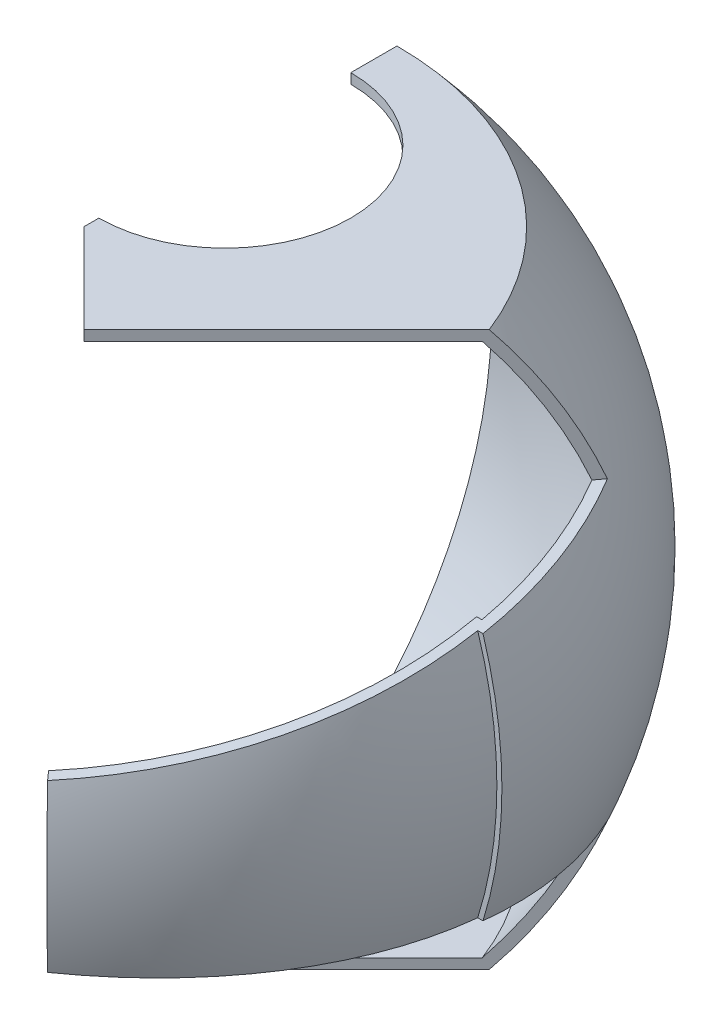
ISO-10303-21;
HEADER;
FILE_DESCRIPTION(('STEP AP214'),'2;1');
FILE_NAME('part.step','',(''),(''),'','','');
FILE_SCHEMA(('AUTOMOTIVE_DESIGN { 1 0 10303 214 1 1 1 1 }'));
ENDSEC;
DATA;
#1=APPLICATION_CONTEXT('core data for automotive mechanical design processes');
#2=APPLICATION_PROTOCOL_DEFINITION('international standard','automotive_design',2000,#1);
#3=PRODUCT_CONTEXT('',#1,'mechanical');
#4=PRODUCT('Part','Part','',(#3));
#5=PRODUCT_RELATED_PRODUCT_CATEGORY('part','',(#4));
#6=PRODUCT_DEFINITION_FORMATION('','',#4);
#7=PRODUCT_DEFINITION_CONTEXT('part definition',#1,'design');
#8=PRODUCT_DEFINITION('design','',#6,#7);
#9=PRODUCT_DEFINITION_SHAPE('','',#8);
#10=(LENGTH_UNIT() NAMED_UNIT(*) SI_UNIT(.MILLI.,.METRE.));
#11=(NAMED_UNIT(*) PLANE_ANGLE_UNIT() SI_UNIT($,.RADIAN.));
#12=(NAMED_UNIT(*) SI_UNIT($,.STERADIAN.) SOLID_ANGLE_UNIT());
#13=UNCERTAINTY_MEASURE_WITH_UNIT(LENGTH_MEASURE(1.E-05),#10,'distance_accuracy_value','');
#14=(GEOMETRIC_REPRESENTATION_CONTEXT(3) GLOBAL_UNCERTAINTY_ASSIGNED_CONTEXT((#13)) GLOBAL_UNIT_ASSIGNED_CONTEXT((#10,
#11,#12)) REPRESENTATION_CONTEXT('',''));
#15=CARTESIAN_POINT('',(0.,0.,0.));
#16=DIRECTION('',(0.,0.,1.));
#17=DIRECTION('',(1.,0.,0.));
#18=AXIS2_PLACEMENT_3D('',#15,#16,#17);
#19=CARTESIAN_POINT('',(0.,55.,0.));
#20=DIRECTION('',(0.750387128659196,0.,-0.660998606006554));
#21=DIRECTION('',(-0.660998606006554,0.,-0.750387128659196));
#22=AXIS2_PLACEMENT_3D('',#19,#20,#21);
#23=PLANE('',#22);
#24=CARTESIAN_POINT('',(0.,0.,0.));
#25=DIRECTION('',(0.750387128659196,0.,-0.660998606006554));
#26=DIRECTION('',(-0.660998606006554,0.,-0.750387128659196));
#27=AXIS2_PLACEMENT_3D('',#24,#25,#26);
#28=CIRCLE('',#27,80.);
#29=CARTESIAN_POINT('',(51.7144227177922,-16.7033371988998,58.7078956307016));
#30=VERTEX_POINT('',#29);
#31=CARTESIAN_POINT('',(51.7144227177921,16.7033371989004,58.7078956307015));
#32=VERTEX_POINT('',#31);
#33=EDGE_CURVE('E311',#30,#32,#28,.F.);
#34=ORIENTED_EDGE('',*,*,#33,.F.);
#35=DIRECTION('',(0.657579727016787,0.101576744243743,0.746505905968177));
#36=VECTOR('',#35,1.);
#37=CARTESIAN_POINT('',(-18.6599209054811,-27.5741052743883,-21.1833494685659));
#38=LINE('',#37,#36);
#39=CARTESIAN_POINT('',(53.0945878796753,-16.4901422388016,60.2747040376933));
#40=VERTEX_POINT('',#39);
#41=EDGE_CURVE('E284',#30,#40,#38,.T.);
#42=ORIENTED_EDGE('',*,*,#41,.T.);
#43=CARTESIAN_POINT('',(0.,0.,0.));
#44=DIRECTION('',(0.750387128659196,0.,-0.660998606006554));
#45=DIRECTION('',(-0.660998606006554,0.,-0.750387128659196));
#46=AXIS2_PLACEMENT_3D('',#43,#44,#45);
#47=CIRCLE('',#46,82.);
#48=CARTESIAN_POINT('',(53.0945878796752,16.4901422388022,60.2747040376933));
#49=VERTEX_POINT('',#48);
#50=EDGE_CURVE('E216',#40,#49,#47,.F.);
#51=ORIENTED_EDGE('',*,*,#50,.T.);
#52=DIRECTION('',(-0.657579727016787,0.101576744243744,-0.746505905968177));
#53=VECTOR('',#52,1.);
#54=CARTESIAN_POINT('',(-18.6599209054811,27.5741052743889,-21.1833494685658));
#55=LINE('',#54,#53);
#56=EDGE_CURVE('E286',#49,#32,#55,.T.);
#57=ORIENTED_EDGE('',*,*,#56,.T.);
#58=EDGE_LOOP('',(#34,#42,#51,#57));
#59=FACE_BOUND('',#58,.T.);
#60=ADVANCED_FACE('F34',(#59),#23,.F.);
#61=CARTESIAN_POINT('',(0.,0.,0.));
#62=DIRECTION('',(-1.,0.,0.));
#63=DIRECTION('',(0.,0.,1.));
#64=AXIS2_PLACEMENT_3D('',#61,#62,#63);
#65=PLANE('',#64);
#66=DIRECTION('',(0.,0.,1.));
#67=VECTOR('',#66,1.);
#68=CARTESIAN_POINT('',(0.,-53.,0.));
#69=LINE('',#68,#67);
#70=CARTESIAN_POINT('',(0.,-53.,-3.));
#71=VERTEX_POINT('',#70);
#72=CARTESIAN_POINT('',(0.,-53.,0.));
#73=VERTEX_POINT('',#72);
#74=EDGE_CURVE('E171',#71,#73,#69,.T.);
#75=ORIENTED_EDGE('',*,*,#74,.F.);
#76=DIRECTION('',(0.,-1.,0.));
#77=VECTOR('',#76,1.);
#78=CARTESIAN_POINT('',(0.,55.,-3.));
#79=LINE('',#78,#77);
#80=CARTESIAN_POINT('',(0.,-55.,-3.));
#81=VERTEX_POINT('',#80);
#82=EDGE_CURVE('E222',#81,#71,#79,.F.);
#83=ORIENTED_EDGE('',*,*,#82,.F.);
#84=DIRECTION('',(0.,0.,1.));
#85=VECTOR('',#84,1.);
#86=CARTESIAN_POINT('',(0.,-55.,0.));
#87=LINE('',#86,#85);
#88=CARTESIAN_POINT('',(0.,-55.,0.));
#89=VERTEX_POINT('',#88);
#90=EDGE_CURVE('E196',#81,#89,#87,.T.);
#91=ORIENTED_EDGE('',*,*,#90,.T.);
#92=DIRECTION('',(0.,-1.,0.));
#93=VECTOR('',#92,1.);
#94=CARTESIAN_POINT('',(0.,55.,0.));
#95=LINE('',#94,#93);
#96=EDGE_CURVE('E188',#73,#89,#95,.T.);
#97=ORIENTED_EDGE('',*,*,#96,.F.);
#98=EDGE_LOOP('',(#75,#83,#91,#97));
#99=FACE_BOUND('',#98,.T.);
#100=ADVANCED_FACE('F194',(#99),#65,.T.);
#101=CARTESIAN_POINT('',(17.6776695296637,55.,17.6776695296637));
#102=DIRECTION('',(-0.707106781186548,0.,-0.707106781186548));
#103=DIRECTION('',(-0.707106781186548,0.,0.707106781186548));
#104=AXIS2_PLACEMENT_3D('',#101,#102,#103);
#105=PLANE('',#104);
#106=DIRECTION('',(0.707106781186548,0.,-0.707106781186548));
#107=VECTOR('',#106,1.);
#108=CARTESIAN_POINT('',(17.6776695296637,-53.,17.6776695296637));
#109=LINE('',#108,#107);
#110=CARTESIAN_POINT('',(17.6776695296637,-53.,17.6776695296637));
#111=VERTEX_POINT('',#110);
#112=CARTESIAN_POINT('',(57.2187873691988,-53.,-21.8634483098714));
#113=VERTEX_POINT('',#112);
#114=EDGE_CURVE('E191',#111,#113,#109,.T.);
#115=ORIENTED_EDGE('',*,*,#114,.F.);
#116=DIRECTION('',(0.,-1.,0.));
#117=VECTOR('',#116,1.);
#118=CARTESIAN_POINT('',(17.6776695296637,55.,17.6776695296637));
#119=LINE('',#118,#117);
#120=CARTESIAN_POINT('',(17.6776695296637,-55.,17.6776695296637));
#121=VERTEX_POINT('',#120);
#122=EDGE_CURVE('E190',#111,#121,#119,.T.);
#123=ORIENTED_EDGE('',*,*,#122,.T.);
#124=DIRECTION('',(0.707106781186547,0.,-0.707106781186547));
#125=VECTOR('',#124,1.);
#126=CARTESIAN_POINT('',(17.6776695296637,-55.,17.6776695296637));
#127=LINE('',#126,#125);
#128=CARTESIAN_POINT('',(57.9206813453815,-55.,-22.5653422860541));
#129=VERTEX_POINT('',#128);
#130=EDGE_CURVE('E247',#121,#129,#127,.T.);
#131=ORIENTED_EDGE('',*,*,#130,.T.);
#132=CARTESIAN_POINT('',(17.6776695296637,0.,17.6776695296637));
#133=DIRECTION('',(-0.707106781186548,0.,-0.707106781186548));
#134=DIRECTION('',(-0.707106781186548,0.,0.707106781186548));
#135=AXIS2_PLACEMENT_3D('',#132,#133,#134);
#136=CIRCLE('',#135,79.1454357496375);
#137=CARTESIAN_POINT('',(69.6493163382024,-29.3580628791651,-34.2939772788751));
#138=VERTEX_POINT('',#137);
#139=EDGE_CURVE('E276',#129,#138,#136,.F.);
#140=ORIENTED_EDGE('',*,*,#139,.T.);
#141=DIRECTION('',(-0.70385632391182,0.0957734335746568,0.70385632391182));
#142=VECTOR('',#141,1.);
#143=CARTESIAN_POINT('',(12.4677429078581,-21.5773902637812,22.8875961514693));
#144=LINE('',#143,#142);
#145=CARTESIAN_POINT('',(68.1077043208193,-29.1482963811898,-32.7523652614919));
#146=VERTEX_POINT('',#145);
#147=EDGE_CURVE('E252',#138,#146,#144,.T.);
#148=ORIENTED_EDGE('',*,*,#147,.T.);
#149=CARTESIAN_POINT('',(17.6776695296637,0.,17.6776695296637));
#150=DIRECTION('',(-0.707106781186548,0.,-0.707106781186548));
#151=DIRECTION('',(-0.707106781186548,0.,0.707106781186548));
#152=AXIS2_PLACEMENT_3D('',#149,#150,#151);
#153=CIRCLE('',#152,77.0454411370329);
#154=EDGE_CURVE('E318',#113,#146,#153,.F.);
#155=ORIENTED_EDGE('',*,*,#154,.F.);
#156=EDGE_LOOP('',(#115,#123,#131,#140,#148,#155));
#157=FACE_BOUND('',#156,.T.);
#158=ADVANCED_FACE('F350',(#157),#105,.F.);
#159=CARTESIAN_POINT('',(17.6776695296637,0.,17.6776695296637));
#160=DIRECTION('',(-0.707106781186548,0.,-0.707106781186548));
#161=DIRECTION('',(-0.707106781186548,0.,0.707106781186548));
#162=AXIS2_PLACEMENT_3D('',#159,#160,#161);
#163=CIRCLE('',#162,77.0454411370329);
#164=CARTESIAN_POINT('',(68.1077043208191,29.1482963811903,-32.7523652614917));
#165=VERTEX_POINT('',#164);
#166=CARTESIAN_POINT('',(57.2187873691988,53.,-21.8634483098714));
#167=VERTEX_POINT('',#166);
#168=EDGE_CURVE('E315',#165,#167,#163,.F.);
#169=ORIENTED_EDGE('',*,*,#168,.F.);
#170=DIRECTION('',(0.70385632391182,0.095773433574657,-0.70385632391182));
#171=VECTOR('',#170,1.);
#172=CARTESIAN_POINT('',(19.8829239651279,22.5863708274365,15.4724150941995));
#173=LINE('',#172,#171);
#174=CARTESIAN_POINT('',(69.6493163382023,29.3580628791656,-34.2939772788749));
#175=VERTEX_POINT('',#174);
#176=EDGE_CURVE('E257',#165,#175,#173,.T.);
#177=ORIENTED_EDGE('',*,*,#176,.T.);
#178=CARTESIAN_POINT('',(57.9206813453815,55.,-22.5653422860541));
#179=VERTEX_POINT('',#178);
#180=EDGE_CURVE('E277',#175,#179,#136,.F.);
#181=ORIENTED_EDGE('',*,*,#180,.T.);
#182=DIRECTION('',(0.707106781186547,0.,-0.707106781186547));
#183=VECTOR('',#182,1.);
#184=CARTESIAN_POINT('',(17.6776695296637,55.,17.6776695296637));
#185=LINE('',#184,#183);
#186=CARTESIAN_POINT('',(17.6776695296637,55.,17.6776695296637));
#187=VERTEX_POINT('',#186);
#188=EDGE_CURVE('E199',#187,#179,#185,.T.);
#189=ORIENTED_EDGE('',*,*,#188,.F.);
#190=CARTESIAN_POINT('',(17.6776695296637,53.,17.6776695296637));
#191=VERTEX_POINT('',#190);
#192=EDGE_CURVE('E207',#187,#191,#119,.T.);
#193=ORIENTED_EDGE('',*,*,#192,.T.);
#194=DIRECTION('',(0.707106781186548,0.,-0.707106781186548));
#195=VECTOR('',#194,1.);
#196=CARTESIAN_POINT('',(17.6776695296637,53.,17.6776695296637));
#197=LINE('',#196,#195);
#198=EDGE_CURVE('E182',#191,#167,#197,.T.);
#199=ORIENTED_EDGE('',*,*,#198,.T.);
#200=EDGE_LOOP('',(#169,#177,#181,#189,#193,#199));
#201=FACE_BOUND('',#200,.T.);
#202=ADVANCED_FACE('F352',(#201),#105,.F.);
#203=CARTESIAN_POINT('',(-125.508384945895,-14.9999999999997,71.2260294643967));
#204=DIRECTION('',(0.,-0.990869134024361,0.134827145774922));
#205=DIRECTION('',(0.,-0.134827145774922,-0.990869134024361));
#206=AXIS2_PLACEMENT_3D('',#203,#204,#205);
#207=PLANE('',#206);
#208=ORIENTED_EDGE('',*,*,#41,.F.);
#209=CARTESIAN_POINT('',(0.,-24.2428413162469,3.29871320834137));
#210=DIRECTION('',(0.,-0.990869134024361,0.134827145774922));
#211=DIRECTION('',(0.,-0.134827145774922,-0.990869134024361));
#212=AXIS2_PLACEMENT_3D('',#209,#210,#211);
#213=CIRCLE('',#212,76.1669425412651);
#214=CARTESIAN_POINT('',(75.9789901389921,-24.9638349910212,-2.00000000000027));
#215=VERTEX_POINT('',#214);
#216=EDGE_CURVE('E327',#30,#215,#213,.F.);
#217=ORIENTED_EDGE('',*,*,#216,.T.);
#218=DIRECTION('',(1.,0.,0.));
#219=VECTOR('',#218,1.);
#220=CARTESIAN_POINT('',(-125.508384945895,-24.9638349910211,-1.99999999999956));
#221=LINE('',#220,#219);
#222=CARTESIAN_POINT('',(77.0312075884902,-24.9638349910212,-2.00000000000027));
#223=VERTEX_POINT('',#222);
#224=EDGE_CURVE('E323',#215,#223,#221,.T.);
#225=ORIENTED_EDGE('',*,*,#224,.T.);
#226=CARTESIAN_POINT('',(0.,-24.2428413162469,3.29871320834137));
#227=DIRECTION('',(0.,-0.990869134024361,0.134827145774922));
#228=DIRECTION('',(0.,-0.134827145774922,-0.990869134024361));
#229=AXIS2_PLACEMENT_3D('',#226,#227,#228);
#230=CIRCLE('',#229,77.2165988378431);
#231=EDGE_CURVE('E319',#223,#146,#230,.F.);
#232=ORIENTED_EDGE('',*,*,#231,.T.);
#233=ORIENTED_EDGE('',*,*,#147,.F.);
#234=CARTESIAN_POINT('',(0.,-24.2428413162469,3.29871320834137));
#235=DIRECTION('',(0.,-0.990869134024361,0.134827145774922));
#236=DIRECTION('',(0.,-0.134827145774922,-0.990869134024361));
#237=AXIS2_PLACEMENT_3D('',#234,#235,#236);
#238=CIRCLE('',#237,79.3120617313936);
#239=CARTESIAN_POINT('',(79.2421614853862,-24.6916958332954,-2.7668046124706E-13));
#240=VERTEX_POINT('',#239);
#241=EDGE_CURVE('E279',#240,#138,#238,.F.);
#242=ORIENTED_EDGE('',*,*,#241,.F.);
#243=DIRECTION('',(1.,0.,0.));
#244=VECTOR('',#243,1.);
#245=CARTESIAN_POINT('',(-125.508384945895,-24.6916958332953,4.44089209850063E-13));
#246=LINE('',#245,#244);
#247=CARTESIAN_POINT('',(78.1941184289203,-24.6916958332954,-2.73013305301865E-13));
#248=VERTEX_POINT('',#247);
#249=EDGE_CURVE('E289',#248,#240,#246,.T.);
#250=ORIENTED_EDGE('',*,*,#249,.F.);
#251=CARTESIAN_POINT('',(0.,-24.2428413162469,3.29871320834137));
#252=DIRECTION('',(0.,-0.990869134024361,0.134827145774922));
#253=DIRECTION('',(0.,-0.134827145774922,-0.990869134024361));
#254=AXIS2_PLACEMENT_3D('',#251,#252,#253);
#255=CIRCLE('',#254,78.2649547120829);
#256=EDGE_CURVE('E293',#40,#248,#255,.F.);
#257=ORIENTED_EDGE('',*,*,#256,.F.);
#258=EDGE_LOOP('',(#208,#217,#225,#232,#233,#242,#250,#257));
#259=FACE_BOUND('',#258,.T.);
#260=ADVANCED_FACE('F358',(#259),#207,.T.);
#261=CARTESIAN_POINT('',(-125.508384945895,15.0000000000003,71.2260294643967));
#262=DIRECTION('',(0.,0.990869134024361,0.134827145774923));
#263=DIRECTION('',(0.,-0.134827145774923,0.990869134024361));
#264=AXIS2_PLACEMENT_3D('',#261,#262,#263);
#265=PLANE('',#264);
#266=DIRECTION('',(-1.,0.,0.));
#267=VECTOR('',#266,1.);
#268=CARTESIAN_POINT('',(-125.508384945895,24.9638349910216,-1.99999999999956));
#269=LINE('',#268,#267);
#270=CARTESIAN_POINT('',(77.03120758849,24.9638349910217,-2.00000000000027));
#271=VERTEX_POINT('',#270);
#272=CARTESIAN_POINT('',(75.978990138992,24.9638349910217,-2.00000000000027));
#273=VERTEX_POINT('',#272);
#274=EDGE_CURVE('E324',#271,#273,#269,.T.);
#275=ORIENTED_EDGE('',*,*,#274,.T.);
#276=CARTESIAN_POINT('',(0.,24.2428413162474,3.29871320834145));
#277=DIRECTION('',(0.,0.990869134024361,0.134827145774923));
#278=DIRECTION('',(0.,-0.134827145774923,0.990869134024361));
#279=AXIS2_PLACEMENT_3D('',#276,#277,#278);
#280=CIRCLE('',#279,76.1669425412649);
#281=EDGE_CURVE('E328',#273,#32,#280,.F.);
#282=ORIENTED_EDGE('',*,*,#281,.T.);
#283=ORIENTED_EDGE('',*,*,#56,.F.);
#284=CARTESIAN_POINT('',(0.,24.2428413162474,3.29871320834145));
#285=DIRECTION('',(0.,0.990869134024361,0.134827145774923));
#286=DIRECTION('',(0.,-0.134827145774923,0.990869134024361));
#287=AXIS2_PLACEMENT_3D('',#284,#285,#286);
#288=CIRCLE('',#287,78.2649547120827);
#289=CARTESIAN_POINT('',(78.1941184289202,24.6916958332959,-2.73013305301865E-13));
#290=VERTEX_POINT('',#289);
#291=EDGE_CURVE('E295',#290,#49,#288,.F.);
#292=ORIENTED_EDGE('',*,*,#291,.F.);
#293=DIRECTION('',(-1.,0.,0.));
#294=VECTOR('',#293,1.);
#295=CARTESIAN_POINT('',(-125.508384945895,24.6916958332958,4.44089209850063E-13));
#296=LINE('',#295,#294);
#297=CARTESIAN_POINT('',(79.242161485386,24.6916958332959,-2.76463620812563E-13));
#298=VERTEX_POINT('',#297);
#299=EDGE_CURVE('E291',#298,#290,#296,.T.);
#300=ORIENTED_EDGE('',*,*,#299,.F.);
#301=CARTESIAN_POINT('',(0.,24.2428413162474,3.29871320834145));
#302=DIRECTION('',(0.,0.990869134024361,0.134827145774923));
#303=DIRECTION('',(0.,-0.134827145774923,0.990869134024361));
#304=AXIS2_PLACEMENT_3D('',#301,#302,#303);
#305=CIRCLE('',#304,79.3120617313934);
#306=EDGE_CURVE('E281',#175,#298,#305,.F.);
#307=ORIENTED_EDGE('',*,*,#306,.F.);
#308=ORIENTED_EDGE('',*,*,#176,.F.);
#309=CARTESIAN_POINT('',(0.,24.2428413162474,3.29871320834145));
#310=DIRECTION('',(0.,0.990869134024361,0.134827145774923));
#311=DIRECTION('',(0.,-0.134827145774923,0.990869134024361));
#312=AXIS2_PLACEMENT_3D('',#309,#310,#311);
#313=CIRCLE('',#312,77.2165988378429);
#314=EDGE_CURVE('E320',#165,#271,#313,.F.);
#315=ORIENTED_EDGE('',*,*,#314,.T.);
#316=EDGE_LOOP('',(#275,#282,#283,#292,#300,#307,#308,#315));
#317=FACE_BOUND('',#316,.T.);
#318=ADVANCED_FACE('F377',(#317),#265,.T.);
#319=CARTESIAN_POINT('',(0.,55.,0.));
#320=DIRECTION('',(0.707106781186546,0.,-0.707106781186549));
#321=DIRECTION('',(-0.707106781186549,0.,-0.707106781186546));
#322=AXIS2_PLACEMENT_3D('',#319,#320,#321);
#323=PLANE('',#322);
#324=DIRECTION('',(0.707106781186549,0.,0.707106781186546));
#325=VECTOR('',#324,1.);
#326=CARTESIAN_POINT('',(0.,-53.,0.));
#327=LINE('',#326,#325);
#328=EDGE_CURVE('E175',#73,#111,#327,.T.);
#329=ORIENTED_EDGE('',*,*,#328,.F.);
#330=ORIENTED_EDGE('',*,*,#96,.T.);
#331=DIRECTION('',(0.707106781186549,0.,0.707106781186546));
#332=VECTOR('',#331,1.);
#333=CARTESIAN_POINT('',(0.,-55.,0.));
#334=LINE('',#333,#332);
#335=EDGE_CURVE('E250',#89,#121,#334,.T.);
#336=ORIENTED_EDGE('',*,*,#335,.T.);
#337=ORIENTED_EDGE('',*,*,#122,.F.);
#338=EDGE_LOOP('',(#329,#330,#336,#337));
#339=FACE_BOUND('',#338,.T.);
#340=ADVANCED_FACE('F186',(#339),#323,.F.);
#341=CARTESIAN_POINT('',(-4.61029879028249E-13,55.,-28.));
#342=DIRECTION('',(0.,-1.,0.));
#343=DIRECTION('',(0.,0.,-1.));
#344=AXIS2_PLACEMENT_3D('',#341,#342,#343);
#345=CYLINDRICAL_SURFACE('',#344,25.);
#346=CARTESIAN_POINT('',(-4.61029879028249E-13,-53.,-28.));
#347=DIRECTION('',(0.,1.,0.));
#348=DIRECTION('',(0.,0.,1.));
#349=AXIS2_PLACEMENT_3D('',#346,#347,#348);
#350=CIRCLE('',#349,25.);
#351=CARTESIAN_POINT('',(-3.70097021917372E-13,-53.,-53.));
#352=VERTEX_POINT('',#351);
#353=EDGE_CURVE('E178',#352,#71,#350,.F.);
#354=ORIENTED_EDGE('',*,*,#353,.F.);
#355=DIRECTION('',(0.,-1.,0.));
#356=VECTOR('',#355,1.);
#357=CARTESIAN_POINT('',(-3.70097021917372E-13,55.,-53.));
#358=LINE('',#357,#356);
#359=CARTESIAN_POINT('',(-3.70097021917372E-13,-55.,-53.));
#360=VERTEX_POINT('',#359);
#361=EDGE_CURVE('E42',#352,#360,#358,.T.);
#362=ORIENTED_EDGE('',*,*,#361,.T.);
#363=CARTESIAN_POINT('',(-4.61029879028249E-13,-55.,-28.));
#364=DIRECTION('',(0.,-1.,0.));
#365=DIRECTION('',(0.,0.,-1.));
#366=AXIS2_PLACEMENT_3D('',#363,#364,#365);
#367=CIRCLE('',#366,25.);
#368=EDGE_CURVE('E57',#360,#81,#367,.T.);
#369=ORIENTED_EDGE('',*,*,#368,.T.);
#370=ORIENTED_EDGE('',*,*,#82,.T.);
#371=EDGE_LOOP('',(#354,#362,#369,#370));
#372=FACE_BOUND('',#371,.T.);
#373=ADVANCED_FACE('F424',(#372),#345,.F.);
#374=DIRECTION('',(0.,0.,-1.));
#375=VECTOR('',#374,1.);
#376=CARTESIAN_POINT('',(0.,53.,0.));
#377=LINE('',#376,#375);
#378=CARTESIAN_POINT('',(-3.70097021917372E-13,53.,-53.));
#379=VERTEX_POINT('',#378);
#380=CARTESIAN_POINT('',(-4.27731402433658E-13,53.,-61.2535713244542));
#381=VERTEX_POINT('',#380);
#382=EDGE_CURVE('E303',#379,#381,#377,.T.);
#383=ORIENTED_EDGE('',*,*,#382,.F.);
#384=CARTESIAN_POINT('',(-3.70097021917372E-13,55.,-53.));
#385=VERTEX_POINT('',#384);
#386=EDGE_CURVE('E11',#385,#379,#358,.T.);
#387=ORIENTED_EDGE('',*,*,#386,.F.);
#388=DIRECTION('',(0.,0.,-1.));
#389=VECTOR('',#388,1.);
#390=CARTESIAN_POINT('',(0.,55.,0.));
#391=LINE('',#390,#389);
#392=CARTESIAN_POINT('',(-4.34068509128173E-13,55.,-62.1610810716802));
#393=VERTEX_POINT('',#392);
#394=EDGE_CURVE('E212',#385,#393,#391,.T.);
#395=ORIENTED_EDGE('',*,*,#394,.T.);
#396=CARTESIAN_POINT('',(0.,0.,0.));
#397=DIRECTION('',(-1.,0.,0.));
#398=DIRECTION('',(0.,0.,1.));
#399=AXIS2_PLACEMENT_3D('',#396,#397,#398);
#400=CIRCLE('',#399,83.);
#401=CARTESIAN_POINT('',(-4.34068509128173E-13,-55.,-62.1610810716802));
#402=VERTEX_POINT('',#401);
#403=EDGE_CURVE('E262',#402,#393,#400,.F.);
#404=ORIENTED_EDGE('',*,*,#403,.F.);
#405=EDGE_CURVE('E209',#402,#360,#87,.T.);
#406=ORIENTED_EDGE('',*,*,#405,.T.);
#407=ORIENTED_EDGE('',*,*,#361,.F.);
#408=DIRECTION('',(0.,0.,1.));
#409=VECTOR('',#408,1.);
#410=CARTESIAN_POINT('',(0.,-53.,0.));
#411=LINE('',#410,#409);
#412=CARTESIAN_POINT('',(-4.27731402433658E-13,-53.,-61.2535713244542));
#413=VERTEX_POINT('',#412);
#414=EDGE_CURVE('E181',#413,#352,#411,.T.);
#415=ORIENTED_EDGE('',*,*,#414,.F.);
#416=CARTESIAN_POINT('',(0.,0.,0.));
#417=DIRECTION('',(-1.,0.,0.));
#418=DIRECTION('',(0.,0.,1.));
#419=AXIS2_PLACEMENT_3D('',#416,#417,#418);
#420=CIRCLE('',#419,81.);
#421=EDGE_CURVE('E192',#413,#381,#420,.F.);
#422=ORIENTED_EDGE('',*,*,#421,.T.);
#423=EDGE_LOOP('',(#383,#387,#395,#404,#406,#407,#415,#422));
#424=FACE_BOUND('',#423,.T.);
#425=ADVANCED_FACE('F360',(#424),#65,.T.);
#426=CARTESIAN_POINT('',(0.,-55.,0.));
#427=DIRECTION('',(0.,1.,0.));
#428=DIRECTION('',(0.,0.,1.));
#429=AXIS2_PLACEMENT_3D('',#426,#427,#428);
#430=PLANE('',#429);
#431=ORIENTED_EDGE('',*,*,#90,.F.);
#432=ORIENTED_EDGE('',*,*,#368,.F.);
#433=ORIENTED_EDGE('',*,*,#405,.F.);
#434=CARTESIAN_POINT('',(0.,-55.,0.));
#435=DIRECTION('',(0.,1.,0.));
#436=DIRECTION('',(0.,0.,1.));
#437=AXIS2_PLACEMENT_3D('',#434,#435,#436);
#438=CIRCLE('',#437,62.1610810716802);
#439=EDGE_CURVE('E269',#402,#129,#438,.F.);
#440=ORIENTED_EDGE('',*,*,#439,.T.);
#441=ORIENTED_EDGE('',*,*,#130,.F.);
#442=ORIENTED_EDGE('',*,*,#335,.F.);
#443=EDGE_LOOP('',(#431,#432,#433,#440,#441,#442));
#444=FACE_BOUND('',#443,.T.);
#445=ADVANCED_FACE('F36',(#444),#430,.F.);
#446=CARTESIAN_POINT('',(0.,55.,0.));
#447=DIRECTION('',(0.,-1.,0.));
#448=DIRECTION('',(0.,0.,-1.));
#449=AXIS2_PLACEMENT_3D('',#446,#447,#448);
#450=PLANE('',#449);
#451=ORIENTED_EDGE('',*,*,#394,.F.);
#452=CARTESIAN_POINT('',(-4.61029879028249E-13,55.,-28.));
#453=DIRECTION('',(0.,-1.,0.));
#454=DIRECTION('',(0.,0.,-1.));
#455=AXIS2_PLACEMENT_3D('',#452,#453,#454);
#456=CIRCLE('',#455,25.);
#457=CARTESIAN_POINT('',(0.,55.,-3.));
#458=VERTEX_POINT('',#457);
#459=EDGE_CURVE('E227',#385,#458,#456,.T.);
#460=ORIENTED_EDGE('',*,*,#459,.T.);
#461=CARTESIAN_POINT('',(0.,55.,0.));
#462=VERTEX_POINT('',#461);
#463=EDGE_CURVE('E213',#462,#458,#391,.T.);
#464=ORIENTED_EDGE('',*,*,#463,.F.);
#465=DIRECTION('',(0.707106781186549,0.,0.707106781186546));
#466=VECTOR('',#465,1.);
#467=CARTESIAN_POINT('',(0.,55.,0.));
#468=LINE('',#467,#466);
#469=EDGE_CURVE('E203',#462,#187,#468,.T.);
#470=ORIENTED_EDGE('',*,*,#469,.T.);
#471=ORIENTED_EDGE('',*,*,#188,.T.);
#472=CARTESIAN_POINT('',(0.,55.,0.));
#473=DIRECTION('',(0.,-1.,0.));
#474=DIRECTION('',(0.,0.,-1.));
#475=AXIS2_PLACEMENT_3D('',#472,#473,#474);
#476=CIRCLE('',#475,62.1610810716802);
#477=EDGE_CURVE('E274',#179,#393,#476,.F.);
#478=ORIENTED_EDGE('',*,*,#477,.T.);
#479=EDGE_LOOP('',(#451,#460,#464,#470,#471,#478));
#480=FACE_BOUND('',#479,.T.);
#481=ADVANCED_FACE('F234',(#480),#450,.F.);
#482=DIRECTION('',(0.,0.,-1.));
#483=VECTOR('',#482,1.);
#484=CARTESIAN_POINT('',(0.,53.,0.));
#485=LINE('',#484,#483);
#486=CARTESIAN_POINT('',(0.,53.,0.));
#487=VERTEX_POINT('',#486);
#488=CARTESIAN_POINT('',(0.,53.,-3.));
#489=VERTEX_POINT('',#488);
#490=EDGE_CURVE('E49',#487,#489,#485,.T.);
#491=ORIENTED_EDGE('',*,*,#490,.F.);
#492=EDGE_CURVE('E198',#462,#487,#95,.T.);
#493=ORIENTED_EDGE('',*,*,#492,.F.);
#494=ORIENTED_EDGE('',*,*,#463,.T.);
#495=EDGE_CURVE('E221',#489,#458,#79,.F.);
#496=ORIENTED_EDGE('',*,*,#495,.F.);
#497=EDGE_LOOP('',(#491,#493,#494,#496));
#498=FACE_BOUND('',#497,.T.);
#499=ADVANCED_FACE('F240',(#498),#65,.T.);
#500=ORIENTED_EDGE('',*,*,#492,.T.);
#501=DIRECTION('',(0.707106781186549,0.,0.707106781186546));
#502=VECTOR('',#501,1.);
#503=CARTESIAN_POINT('',(0.,53.,0.));
#504=LINE('',#503,#502);
#505=EDGE_CURVE('E244',#487,#191,#504,.T.);
#506=ORIENTED_EDGE('',*,*,#505,.T.);
#507=ORIENTED_EDGE('',*,*,#192,.F.);
#508=ORIENTED_EDGE('',*,*,#469,.F.);
#509=EDGE_LOOP('',(#500,#506,#507,#508));
#510=FACE_BOUND('',#509,.T.);
#511=ADVANCED_FACE('F243',(#510),#323,.F.);
#512=CARTESIAN_POINT('',(0.,0.,0.));
#513=DIRECTION('',(0.,-1.,0.));
#514=DIRECTION('',(0.,0.,1.));
#515=AXIS2_PLACEMENT_3D('',#512,#513,#514);
#516=SPHERICAL_SURFACE('',#515,83.);
#517=ORIENTED_EDGE('',*,*,#306,.T.);
#518=CARTESIAN_POINT('',(0.,0.,0.));
#519=DIRECTION('',(0.,0.,-1.));
#520=DIRECTION('',(-1.,0.,0.));
#521=AXIS2_PLACEMENT_3D('',#518,#519,#520);
#522=CIRCLE('',#521,83.);
#523=EDGE_CURVE('E219',#298,#240,#522,.T.);
#524=ORIENTED_EDGE('',*,*,#523,.T.);
#525=ORIENTED_EDGE('',*,*,#241,.T.);
#526=ORIENTED_EDGE('',*,*,#139,.F.);
#527=ORIENTED_EDGE('',*,*,#439,.F.);
#528=ORIENTED_EDGE('',*,*,#403,.T.);
#529=ORIENTED_EDGE('',*,*,#477,.F.);
#530=ORIENTED_EDGE('',*,*,#180,.F.);
#531=EDGE_LOOP('',(#517,#524,#525,#526,#527,#528,#529,#530));
#532=FACE_BOUND('',#531,.T.);
#533=ADVANCED_FACE('F373',(#532),#516,.T.);
#534=CARTESIAN_POINT('',(0.,0.,0.));
#535=DIRECTION('',(0.,-1.,0.));
#536=DIRECTION('',(1.,0.,0.));
#537=AXIS2_PLACEMENT_3D('',#534,#535,#536);
#538=SPHERICAL_SURFACE('',#537,82.);
#539=ORIENTED_EDGE('',*,*,#256,.T.);
#540=CARTESIAN_POINT('',(0.,0.,0.));
#541=DIRECTION('',(0.,0.,-1.));
#542=DIRECTION('',(-1.,0.,0.));
#543=AXIS2_PLACEMENT_3D('',#540,#541,#542);
#544=CIRCLE('',#543,82.);
#545=EDGE_CURVE('E237',#290,#248,#544,.T.);
#546=ORIENTED_EDGE('',*,*,#545,.F.);
#547=ORIENTED_EDGE('',*,*,#291,.T.);
#548=ORIENTED_EDGE('',*,*,#50,.F.);
#549=EDGE_LOOP('',(#539,#546,#547,#548));
#550=FACE_BOUND('',#549,.T.);
#551=ADVANCED_FACE('F371',(#550),#538,.T.);
#552=CARTESIAN_POINT('',(0.,0.,0.));
#553=DIRECTION('',(0.,0.,-1.));
#554=DIRECTION('',(-1.,0.,0.));
#555=AXIS2_PLACEMENT_3D('',#552,#553,#554);
#556=PLANE('',#555);
#557=ORIENTED_EDGE('',*,*,#249,.T.);
#558=ORIENTED_EDGE('',*,*,#523,.F.);
#559=ORIENTED_EDGE('',*,*,#299,.T.);
#560=ORIENTED_EDGE('',*,*,#545,.T.);
#561=EDGE_LOOP('',(#557,#558,#559,#560));
#562=FACE_BOUND('',#561,.T.);
#563=ADVANCED_FACE('F423',(#562),#556,.F.);
#564=ORIENTED_EDGE('',*,*,#386,.T.);
#565=CARTESIAN_POINT('',(-4.61029879028249E-13,53.,-28.));
#566=DIRECTION('',(0.,-1.,0.));
#567=DIRECTION('',(0.,0.,-1.));
#568=AXIS2_PLACEMENT_3D('',#565,#566,#567);
#569=CIRCLE('',#568,25.);
#570=EDGE_CURVE('E229',#379,#489,#569,.T.);
#571=ORIENTED_EDGE('',*,*,#570,.T.);
#572=ORIENTED_EDGE('',*,*,#495,.T.);
#573=ORIENTED_EDGE('',*,*,#459,.F.);
#574=EDGE_LOOP('',(#564,#571,#572,#573));
#575=FACE_BOUND('',#574,.T.);
#576=ADVANCED_FACE('F226',(#575),#345,.F.);
#577=CARTESIAN_POINT('',(0.,-53.,0.));
#578=DIRECTION('',(0.,1.,0.));
#579=DIRECTION('',(0.,0.,1.));
#580=AXIS2_PLACEMENT_3D('',#577,#578,#579);
#581=PLANE('',#580);
#582=ORIENTED_EDGE('',*,*,#74,.T.);
#583=ORIENTED_EDGE('',*,*,#328,.T.);
#584=ORIENTED_EDGE('',*,*,#114,.T.);
#585=CARTESIAN_POINT('',(0.,-53.,0.));
#586=DIRECTION('',(0.,1.,0.));
#587=DIRECTION('',(0.,0.,1.));
#588=AXIS2_PLACEMENT_3D('',#585,#586,#587);
#589=CIRCLE('',#588,61.2535713244542);
#590=EDGE_CURVE('E306',#413,#113,#589,.F.);
#591=ORIENTED_EDGE('',*,*,#590,.F.);
#592=ORIENTED_EDGE('',*,*,#414,.T.);
#593=ORIENTED_EDGE('',*,*,#353,.T.);
#594=EDGE_LOOP('',(#582,#583,#584,#591,#592,#593));
#595=FACE_BOUND('',#594,.T.);
#596=ADVANCED_FACE('F173',(#595),#581,.T.);
#597=CARTESIAN_POINT('',(0.,53.,0.));
#598=DIRECTION('',(0.,-1.,0.));
#599=DIRECTION('',(0.,0.,-1.));
#600=AXIS2_PLACEMENT_3D('',#597,#598,#599);
#601=PLANE('',#600);
#602=ORIENTED_EDGE('',*,*,#382,.T.);
#603=CARTESIAN_POINT('',(0.,53.,0.));
#604=DIRECTION('',(0.,-1.,0.));
#605=DIRECTION('',(0.,0.,-1.));
#606=AXIS2_PLACEMENT_3D('',#603,#604,#605);
#607=CIRCLE('',#606,61.2535713244542);
#608=EDGE_CURVE('E339',#167,#381,#607,.F.);
#609=ORIENTED_EDGE('',*,*,#608,.F.);
#610=ORIENTED_EDGE('',*,*,#198,.F.);
#611=ORIENTED_EDGE('',*,*,#505,.F.);
#612=ORIENTED_EDGE('',*,*,#490,.T.);
#613=ORIENTED_EDGE('',*,*,#570,.F.);
#614=EDGE_LOOP('',(#602,#609,#610,#611,#612,#613));
#615=FACE_BOUND('',#614,.T.);
#616=ADVANCED_FACE('F408',(#615),#601,.T.);
#617=CARTESIAN_POINT('',(0.,0.,0.));
#618=DIRECTION('',(0.,-1.,0.));
#619=DIRECTION('',(0.,0.,1.));
#620=AXIS2_PLACEMENT_3D('',#617,#618,#619);
#621=SPHERICAL_SURFACE('',#620,81.);
#622=ORIENTED_EDGE('',*,*,#314,.F.);
#623=ORIENTED_EDGE('',*,*,#168,.T.);
#624=ORIENTED_EDGE('',*,*,#608,.T.);
#625=ORIENTED_EDGE('',*,*,#421,.F.);
#626=ORIENTED_EDGE('',*,*,#590,.T.);
#627=ORIENTED_EDGE('',*,*,#154,.T.);
#628=ORIENTED_EDGE('',*,*,#231,.F.);
#629=CARTESIAN_POINT('',(0.,0.,-2.));
#630=DIRECTION('',(0.,0.,-1.));
#631=DIRECTION('',(-1.,0.,0.));
#632=AXIS2_PLACEMENT_3D('',#629,#630,#631);
#633=CIRCLE('',#632,80.9753048774749);
#634=EDGE_CURVE('E299',#271,#223,#633,.T.);
#635=ORIENTED_EDGE('',*,*,#634,.F.);
#636=EDGE_LOOP('',(#622,#623,#624,#625,#626,#627,#628,#635));
#637=FACE_BOUND('',#636,.T.);
#638=ADVANCED_FACE('F347',(#637),#621,.F.);
#639=CARTESIAN_POINT('',(0.,0.,0.));
#640=DIRECTION('',(0.,-1.,0.));
#641=DIRECTION('',(1.,0.,0.));
#642=AXIS2_PLACEMENT_3D('',#639,#640,#641);
#643=SPHERICAL_SURFACE('',#642,80.);
#644=ORIENTED_EDGE('',*,*,#216,.F.);
#645=ORIENTED_EDGE('',*,*,#33,.T.);
#646=ORIENTED_EDGE('',*,*,#281,.F.);
#647=CARTESIAN_POINT('',(0.,0.,-2.));
#648=DIRECTION('',(0.,0.,-1.));
#649=DIRECTION('',(-1.,0.,0.));
#650=AXIS2_PLACEMENT_3D('',#647,#648,#649);
#651=CIRCLE('',#650,79.9749960925288);
#652=EDGE_CURVE('E309',#273,#215,#651,.T.);
#653=ORIENTED_EDGE('',*,*,#652,.T.);
#654=EDGE_LOOP('',(#644,#645,#646,#653));
#655=FACE_BOUND('',#654,.T.);
#656=ADVANCED_FACE('F397',(#655),#643,.F.);
#657=CARTESIAN_POINT('',(0.,0.,-2.));
#658=DIRECTION('',(0.,0.,-1.));
#659=DIRECTION('',(-1.,0.,0.));
#660=AXIS2_PLACEMENT_3D('',#657,#658,#659);
#661=PLANE('',#660);
#662=ORIENTED_EDGE('',*,*,#224,.F.);
#663=ORIENTED_EDGE('',*,*,#652,.F.);
#664=ORIENTED_EDGE('',*,*,#274,.F.);
#665=ORIENTED_EDGE('',*,*,#634,.T.);
#666=EDGE_LOOP('',(#662,#663,#664,#665));
#667=FACE_BOUND('',#666,.T.);
#668=ADVANCED_FACE('F400',(#667),#661,.T.);
#669=CLOSED_SHELL('',(#60,#100,#158,#202,#260,#318,#340,#373,#425,#445,#481,#499,#511,#533,#551,
#563,#576,#596,#616,#638,#656,#668));
#670=MANIFOLD_SOLID_BREP('B2',#669);
#671=ADVANCED_BREP_SHAPE_REPRESENTATION('',(#18,#670),#14);
#672=SHAPE_DEFINITION_REPRESENTATION(#9,#671);
ENDSEC;
END-ISO-10303-21;
